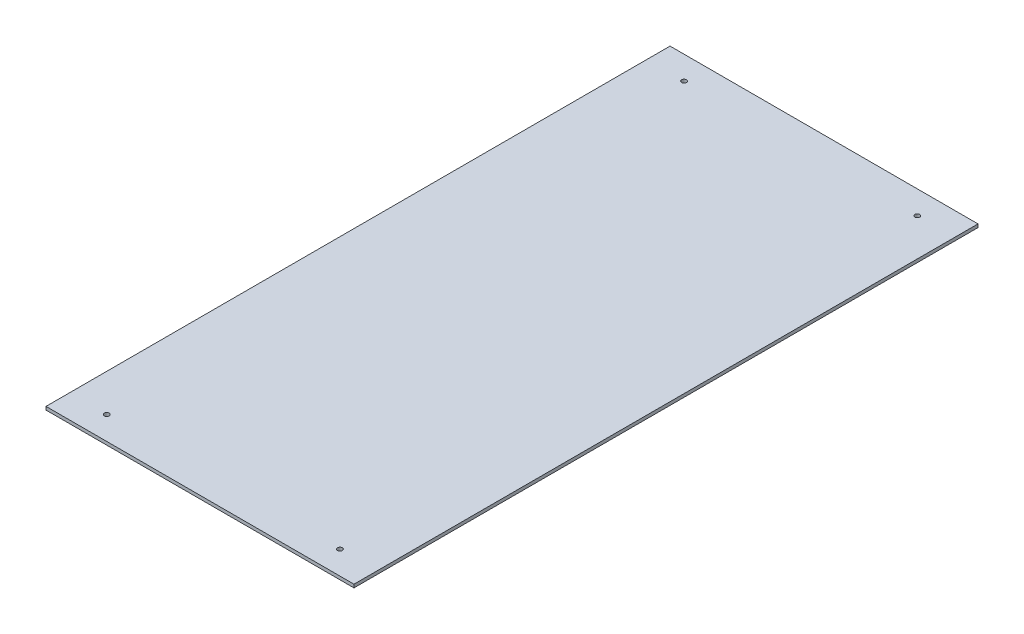
ISO-10303-21;
HEADER;
FILE_DESCRIPTION(('STEP AP214'),'2;1');
FILE_NAME('part.step','',(''),(''),'','','');
FILE_SCHEMA(('AUTOMOTIVE_DESIGN { 1 0 10303 214 1 1 1 1 }'));
ENDSEC;
DATA;
#1=APPLICATION_CONTEXT('core data for automotive mechanical design processes');
#2=APPLICATION_PROTOCOL_DEFINITION('international standard','automotive_design',2000,#1);
#3=PRODUCT_CONTEXT('',#1,'mechanical');
#4=PRODUCT('Part','Part','',(#3));
#5=PRODUCT_RELATED_PRODUCT_CATEGORY('part','',(#4));
#6=PRODUCT_DEFINITION_FORMATION('','',#4);
#7=PRODUCT_DEFINITION_CONTEXT('part definition',#1,'design');
#8=PRODUCT_DEFINITION('design','',#6,#7);
#9=PRODUCT_DEFINITION_SHAPE('','',#8);
#10=(LENGTH_UNIT() NAMED_UNIT(*) SI_UNIT(.MILLI.,.METRE.));
#11=(NAMED_UNIT(*) PLANE_ANGLE_UNIT() SI_UNIT($,.RADIAN.));
#12=(NAMED_UNIT(*) SI_UNIT($,.STERADIAN.) SOLID_ANGLE_UNIT());
#13=UNCERTAINTY_MEASURE_WITH_UNIT(LENGTH_MEASURE(1.E-05),#10,'distance_accuracy_value','');
#14=(GEOMETRIC_REPRESENTATION_CONTEXT(3) GLOBAL_UNCERTAINTY_ASSIGNED_CONTEXT((#13)) GLOBAL_UNIT_ASSIGNED_CONTEXT((#10,
#11,#12)) REPRESENTATION_CONTEXT('',''));
#15=CARTESIAN_POINT('',(0.,0.,0.));
#16=DIRECTION('',(0.,0.,1.));
#17=DIRECTION('',(1.,0.,0.));
#18=AXIS2_PLACEMENT_3D('',#15,#16,#17);
#19=CARTESIAN_POINT('',(0.,2.,0.));
#20=DIRECTION('',(0.,-1.,0.));
#21=DIRECTION('',(0.,0.,-1.));
#22=AXIS2_PLACEMENT_3D('',#19,#20,#21);
#23=PLANE('',#22);
#24=CARTESIAN_POINT('',(71.9300000000001,2.,-178.11));
#25=DIRECTION('',(0.,-1.,0.));
#26=DIRECTION('',(0.,0.,-1.));
#27=AXIS2_PLACEMENT_3D('',#24,#25,#26);
#28=CIRCLE('',#27,1.5);
#29=CARTESIAN_POINT('',(71.9300000000001,2.,-179.61));
#30=VERTEX_POINT('',#29);
#31=EDGE_CURVE('E209',#30,#30,#28,.T.);
#32=ORIENTED_EDGE('',*,*,#31,.T.);
#33=EDGE_LOOP('',(#32));
#34=FACE_BOUND('',#33,.T.);
#35=CARTESIAN_POINT('',(-71.93,2.,178.11));
#36=DIRECTION('',(0.,-1.,0.));
#37=DIRECTION('',(0.,0.,-1.));
#38=AXIS2_PLACEMENT_3D('',#35,#36,#37);
#39=CIRCLE('',#38,1.5);
#40=CARTESIAN_POINT('',(-71.93,2.,176.61));
#41=VERTEX_POINT('',#40);
#42=EDGE_CURVE('E175',#41,#41,#39,.T.);
#43=ORIENTED_EDGE('',*,*,#42,.T.);
#44=EDGE_LOOP('',(#43));
#45=FACE_BOUND('',#44,.T.);
#46=DIRECTION('',(1.,0.,0.));
#47=VECTOR('',#46,1.);
#48=CARTESIAN_POINT('',(-95.,2.,192.5));
#49=LINE('',#48,#47);
#50=CARTESIAN_POINT('',(-95.,2.,192.5));
#51=VERTEX_POINT('',#50);
#52=CARTESIAN_POINT('',(95.,2.,192.5));
#53=VERTEX_POINT('',#52);
#54=EDGE_CURVE('E144',#51,#53,#49,.T.);
#55=ORIENTED_EDGE('',*,*,#54,.T.);
#56=DIRECTION('',(0.,0.,1.));
#57=VECTOR('',#56,1.);
#58=CARTESIAN_POINT('',(95.,2.,-192.5));
#59=LINE('',#58,#57);
#60=CARTESIAN_POINT('',(95.,2.,-192.5));
#61=VERTEX_POINT('',#60);
#62=EDGE_CURVE('E151',#61,#53,#59,.T.);
#63=ORIENTED_EDGE('',*,*,#62,.F.);
#64=DIRECTION('',(1.,0.,0.));
#65=VECTOR('',#64,1.);
#66=CARTESIAN_POINT('',(-95.,2.,-192.5));
#67=LINE('',#66,#65);
#68=CARTESIAN_POINT('',(-95.,2.,-192.5));
#69=VERTEX_POINT('',#68);
#70=EDGE_CURVE('E160',#69,#61,#67,.T.);
#71=ORIENTED_EDGE('',*,*,#70,.F.);
#72=DIRECTION('',(0.,0.,1.));
#73=VECTOR('',#72,1.);
#74=CARTESIAN_POINT('',(-95.,2.,-192.5));
#75=LINE('',#74,#73);
#76=EDGE_CURVE('E121',#69,#51,#75,.T.);
#77=ORIENTED_EDGE('',*,*,#76,.T.);
#78=EDGE_LOOP('',(#55,#63,#71,#77));
#79=FACE_BOUND('',#78,.T.);
#80=CARTESIAN_POINT('',(71.9300000000001,2.,178.11));
#81=DIRECTION('',(0.,1.,0.));
#82=DIRECTION('',(0.,0.,1.));
#83=AXIS2_PLACEMENT_3D('',#80,#81,#82);
#84=CIRCLE('',#83,1.5);
#85=CARTESIAN_POINT('',(71.9300000000001,2.,179.61));
#86=VERTEX_POINT('',#85);
#87=EDGE_CURVE('E216',#86,#86,#84,.T.);
#88=ORIENTED_EDGE('',*,*,#87,.F.);
#89=EDGE_LOOP('',(#88));
#90=FACE_BOUND('',#89,.T.);
#91=CARTESIAN_POINT('',(-71.93,2.,-178.11));
#92=DIRECTION('',(0.,1.,0.));
#93=DIRECTION('',(0.,0.,1.));
#94=AXIS2_PLACEMENT_3D('',#91,#92,#93);
#95=CIRCLE('',#94,1.5);
#96=CARTESIAN_POINT('',(-71.93,2.,-176.61));
#97=VERTEX_POINT('',#96);
#98=EDGE_CURVE('E203',#97,#97,#95,.T.);
#99=ORIENTED_EDGE('',*,*,#98,.F.);
#100=EDGE_LOOP('',(#99));
#101=FACE_BOUND('',#100,.T.);
#102=ADVANCED_FACE('F103',(#34,#45,#79,#90,#101),#23,.F.);
#103=CARTESIAN_POINT('',(0.,0.,0.));
#104=DIRECTION('',(0.,-1.,0.));
#105=DIRECTION('',(0.,0.,-1.));
#106=AXIS2_PLACEMENT_3D('',#103,#104,#105);
#107=PLANE('',#106);
#108=CARTESIAN_POINT('',(71.9300000000001,0.,178.11));
#109=DIRECTION('',(0.,1.,0.));
#110=DIRECTION('',(0.,0.,1.));
#111=AXIS2_PLACEMENT_3D('',#108,#109,#110);
#112=CIRCLE('',#111,1.5);
#113=CARTESIAN_POINT('',(71.9300000000001,0.,179.61));
#114=VERTEX_POINT('',#113);
#115=EDGE_CURVE('E213',#114,#114,#112,.T.);
#116=ORIENTED_EDGE('',*,*,#115,.T.);
#117=EDGE_LOOP('',(#116));
#118=FACE_BOUND('',#117,.T.);
#119=CARTESIAN_POINT('',(-71.93,0.,178.11));
#120=DIRECTION('',(0.,-1.,0.));
#121=DIRECTION('',(0.,0.,-1.));
#122=AXIS2_PLACEMENT_3D('',#119,#120,#121);
#123=CIRCLE('',#122,1.5);
#124=CARTESIAN_POINT('',(-71.93,0.,176.61));
#125=VERTEX_POINT('',#124);
#126=EDGE_CURVE('E220',#125,#125,#123,.T.);
#127=ORIENTED_EDGE('',*,*,#126,.F.);
#128=EDGE_LOOP('',(#127));
#129=FACE_BOUND('',#128,.T.);
#130=DIRECTION('',(1.,0.,0.));
#131=VECTOR('',#130,1.);
#132=CARTESIAN_POINT('',(-95.,0.,192.5));
#133=LINE('',#132,#131);
#134=CARTESIAN_POINT('',(-95.,0.,192.5));
#135=VERTEX_POINT('',#134);
#136=CARTESIAN_POINT('',(95.,0.,192.5));
#137=VERTEX_POINT('',#136);
#138=EDGE_CURVE('E171',#135,#137,#133,.T.);
#139=ORIENTED_EDGE('',*,*,#138,.F.);
#140=DIRECTION('',(0.,0.,1.));
#141=VECTOR('',#140,1.);
#142=CARTESIAN_POINT('',(-95.,0.,-192.5));
#143=LINE('',#142,#141);
#144=CARTESIAN_POINT('',(-95.,0.,-192.5));
#145=VERTEX_POINT('',#144);
#146=EDGE_CURVE('E139',#145,#135,#143,.T.);
#147=ORIENTED_EDGE('',*,*,#146,.F.);
#148=DIRECTION('',(1.,0.,0.));
#149=VECTOR('',#148,1.);
#150=CARTESIAN_POINT('',(-95.,0.,-192.5));
#151=LINE('',#150,#149);
#152=CARTESIAN_POINT('',(95.,0.,-192.5));
#153=VERTEX_POINT('',#152);
#154=EDGE_CURVE('E178',#145,#153,#151,.T.);
#155=ORIENTED_EDGE('',*,*,#154,.T.);
#156=DIRECTION('',(0.,0.,1.));
#157=VECTOR('',#156,1.);
#158=CARTESIAN_POINT('',(95.,0.,-192.5));
#159=LINE('',#158,#157);
#160=EDGE_CURVE('E153',#153,#137,#159,.T.);
#161=ORIENTED_EDGE('',*,*,#160,.T.);
#162=EDGE_LOOP('',(#139,#147,#155,#161));
#163=FACE_BOUND('',#162,.T.);
#164=CARTESIAN_POINT('',(71.9300000000001,0.,-178.11));
#165=DIRECTION('',(0.,-1.,0.));
#166=DIRECTION('',(0.,0.,-1.));
#167=AXIS2_PLACEMENT_3D('',#164,#165,#166);
#168=CIRCLE('',#167,1.5);
#169=CARTESIAN_POINT('',(71.9300000000001,0.,-179.61));
#170=VERTEX_POINT('',#169);
#171=EDGE_CURVE('E197',#170,#170,#168,.T.);
#172=ORIENTED_EDGE('',*,*,#171,.F.);
#173=EDGE_LOOP('',(#172));
#174=FACE_BOUND('',#173,.T.);
#175=CARTESIAN_POINT('',(-71.93,0.,-178.11));
#176=DIRECTION('',(0.,1.,0.));
#177=DIRECTION('',(0.,0.,1.));
#178=AXIS2_PLACEMENT_3D('',#175,#176,#177);
#179=CIRCLE('',#178,1.5);
#180=CARTESIAN_POINT('',(-71.93,0.,-176.61));
#181=VERTEX_POINT('',#180);
#182=EDGE_CURVE('E200',#181,#181,#179,.T.);
#183=ORIENTED_EDGE('',*,*,#182,.T.);
#184=EDGE_LOOP('',(#183));
#185=FACE_BOUND('',#184,.T.);
#186=ADVANCED_FACE('F189',(#118,#129,#163,#174,#185),#107,.T.);
#187=CARTESIAN_POINT('',(-95.,2.,192.5));
#188=DIRECTION('',(0.,0.,-1.));
#189=DIRECTION('',(-1.,0.,0.));
#190=AXIS2_PLACEMENT_3D('',#187,#188,#189);
#191=PLANE('',#190);
#192=ORIENTED_EDGE('',*,*,#138,.T.);
#193=DIRECTION('',(0.,-1.,0.));
#194=VECTOR('',#193,1.);
#195=CARTESIAN_POINT('',(95.,2.,192.5));
#196=LINE('',#195,#194);
#197=EDGE_CURVE('E12',#53,#137,#196,.T.);
#198=ORIENTED_EDGE('',*,*,#197,.F.);
#199=ORIENTED_EDGE('',*,*,#54,.F.);
#200=DIRECTION('',(0.,-1.,0.));
#201=VECTOR('',#200,1.);
#202=CARTESIAN_POINT('',(-95.,2.,192.5));
#203=LINE('',#202,#201);
#204=EDGE_CURVE('E167',#51,#135,#203,.T.);
#205=ORIENTED_EDGE('',*,*,#204,.T.);
#206=EDGE_LOOP('',(#192,#198,#199,#205));
#207=FACE_BOUND('',#206,.T.);
#208=ADVANCED_FACE('F105',(#207),#191,.F.);
#209=CARTESIAN_POINT('',(95.,2.,-192.5));
#210=DIRECTION('',(1.,0.,0.));
#211=DIRECTION('',(0.,0.,-1.));
#212=AXIS2_PLACEMENT_3D('',#209,#210,#211);
#213=PLANE('',#212);
#214=ORIENTED_EDGE('',*,*,#160,.F.);
#215=DIRECTION('',(0.,-1.,0.));
#216=VECTOR('',#215,1.);
#217=CARTESIAN_POINT('',(95.,2.,-192.5));
#218=LINE('',#217,#216);
#219=EDGE_CURVE('E113',#61,#153,#218,.T.);
#220=ORIENTED_EDGE('',*,*,#219,.F.);
#221=ORIENTED_EDGE('',*,*,#62,.T.);
#222=ORIENTED_EDGE('',*,*,#197,.T.);
#223=EDGE_LOOP('',(#214,#220,#221,#222));
#224=FACE_BOUND('',#223,.T.);
#225=ADVANCED_FACE('F150',(#224),#213,.T.);
#226=CARTESIAN_POINT('',(-95.,2.,-192.5));
#227=DIRECTION('',(0.,0.,-1.));
#228=DIRECTION('',(-1.,0.,0.));
#229=AXIS2_PLACEMENT_3D('',#226,#227,#228);
#230=PLANE('',#229);
#231=ORIENTED_EDGE('',*,*,#154,.F.);
#232=DIRECTION('',(0.,-1.,0.));
#233=VECTOR('',#232,1.);
#234=CARTESIAN_POINT('',(-95.,2.,-192.5));
#235=LINE('',#234,#233);
#236=EDGE_CURVE('E136',#69,#145,#235,.T.);
#237=ORIENTED_EDGE('',*,*,#236,.F.);
#238=ORIENTED_EDGE('',*,*,#70,.T.);
#239=ORIENTED_EDGE('',*,*,#219,.T.);
#240=EDGE_LOOP('',(#231,#237,#238,#239));
#241=FACE_BOUND('',#240,.T.);
#242=ADVANCED_FACE('F163',(#241),#230,.T.);
#243=CARTESIAN_POINT('',(-95.,2.,-192.5));
#244=DIRECTION('',(1.,0.,0.));
#245=DIRECTION('',(0.,0.,-1.));
#246=AXIS2_PLACEMENT_3D('',#243,#244,#245);
#247=PLANE('',#246);
#248=ORIENTED_EDGE('',*,*,#146,.T.);
#249=ORIENTED_EDGE('',*,*,#204,.F.);
#250=ORIENTED_EDGE('',*,*,#76,.F.);
#251=ORIENTED_EDGE('',*,*,#236,.T.);
#252=EDGE_LOOP('',(#248,#249,#250,#251));
#253=FACE_BOUND('',#252,.T.);
#254=ADVANCED_FACE('F236',(#253),#247,.F.);
#255=CARTESIAN_POINT('',(-71.93,2.,178.11));
#256=DIRECTION('',(0.,-1.,0.));
#257=DIRECTION('',(0.,0.,-1.));
#258=AXIS2_PLACEMENT_3D('',#255,#256,#257);
#259=CYLINDRICAL_SURFACE('',#258,1.5);
#260=ORIENTED_EDGE('',*,*,#42,.F.);
#261=EDGE_LOOP('',(#260));
#262=FACE_BOUND('',#261,.T.);
#263=ORIENTED_EDGE('',*,*,#126,.T.);
#264=EDGE_LOOP('',(#263));
#265=FACE_BOUND('',#264,.T.);
#266=ADVANCED_FACE('F232',(#262,#265),#259,.F.);
#267=CARTESIAN_POINT('',(71.9300000000001,2.,178.11));
#268=DIRECTION('',(0.,-1.,0.));
#269=DIRECTION('',(0.,0.,-1.));
#270=AXIS2_PLACEMENT_3D('',#267,#268,#269);
#271=CYLINDRICAL_SURFACE('',#270,1.5);
#272=ORIENTED_EDGE('',*,*,#87,.T.);
#273=EDGE_LOOP('',(#272));
#274=FACE_BOUND('',#273,.T.);
#275=ORIENTED_EDGE('',*,*,#115,.F.);
#276=EDGE_LOOP('',(#275));
#277=FACE_BOUND('',#276,.T.);
#278=ADVANCED_FACE('F235',(#274,#277),#271,.F.);
#279=CARTESIAN_POINT('',(71.9300000000001,2.,-178.11));
#280=DIRECTION('',(0.,-1.,0.));
#281=DIRECTION('',(0.,0.,-1.));
#282=AXIS2_PLACEMENT_3D('',#279,#280,#281);
#283=CYLINDRICAL_SURFACE('',#282,1.5);
#284=ORIENTED_EDGE('',*,*,#31,.F.);
#285=EDGE_LOOP('',(#284));
#286=FACE_BOUND('',#285,.T.);
#287=ORIENTED_EDGE('',*,*,#171,.T.);
#288=EDGE_LOOP('',(#287));
#289=FACE_BOUND('',#288,.T.);
#290=ADVANCED_FACE('F243',(#286,#289),#283,.F.);
#291=CARTESIAN_POINT('',(-71.93,2.,-178.11));
#292=DIRECTION('',(0.,-1.,0.));
#293=DIRECTION('',(0.,0.,-1.));
#294=AXIS2_PLACEMENT_3D('',#291,#292,#293);
#295=CYLINDRICAL_SURFACE('',#294,1.5);
#296=ORIENTED_EDGE('',*,*,#98,.T.);
#297=EDGE_LOOP('',(#296));
#298=FACE_BOUND('',#297,.T.);
#299=ORIENTED_EDGE('',*,*,#182,.F.);
#300=EDGE_LOOP('',(#299));
#301=FACE_BOUND('',#300,.T.);
#302=ADVANCED_FACE('F315',(#298,#301),#295,.F.);
#303=CLOSED_SHELL('',(#102,#186,#208,#225,#242,#254,#266,#278,#290,#302));
#304=MANIFOLD_SOLID_BREP('B2',#303);
#305=ADVANCED_BREP_SHAPE_REPRESENTATION('',(#18,#304),#14);
#306=SHAPE_DEFINITION_REPRESENTATION(#9,#305);
ENDSEC;
END-ISO-10303-21;
